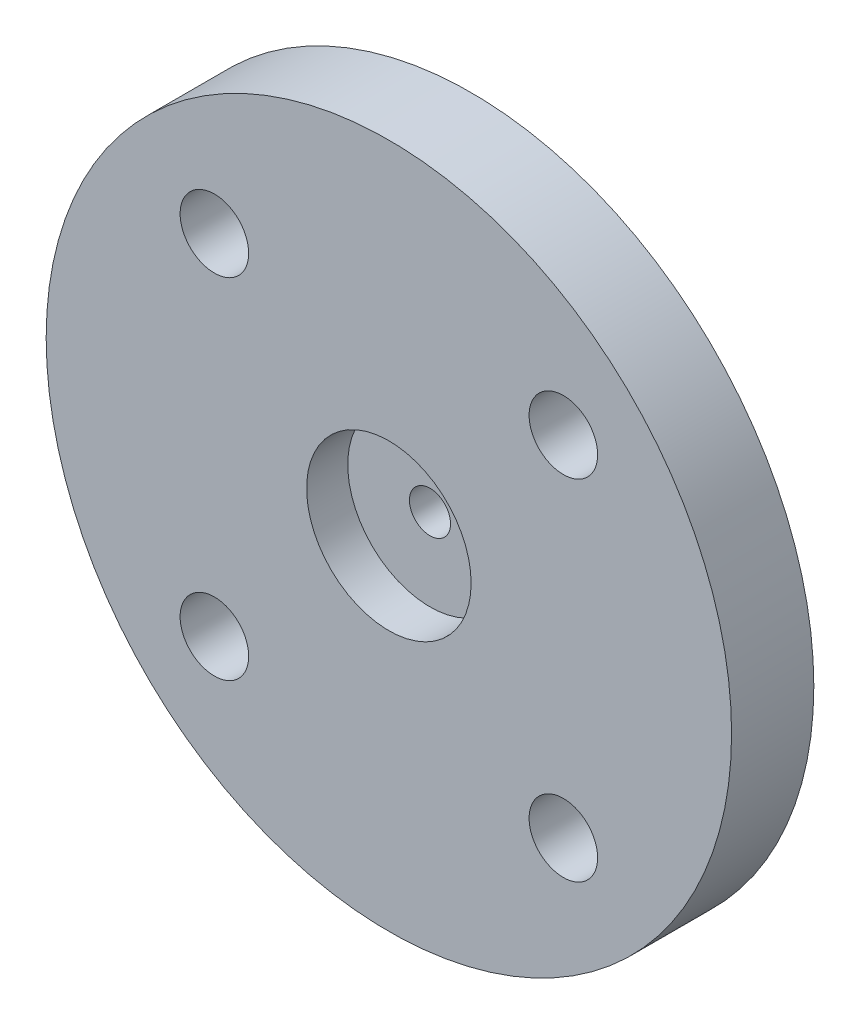
ISO-10303-21;
HEADER;
FILE_DESCRIPTION(('STEP AP214'),'2;1');
FILE_NAME('part.step','',(''),(''),'','','');
FILE_SCHEMA(('AUTOMOTIVE_DESIGN { 1 0 10303 214 1 1 1 1 }'));
ENDSEC;
DATA;
#1=APPLICATION_CONTEXT('core data for automotive mechanical design processes');
#2=APPLICATION_PROTOCOL_DEFINITION('international standard','automotive_design',2000,#1);
#3=PRODUCT_CONTEXT('',#1,'mechanical');
#4=PRODUCT('Part','Part','',(#3));
#5=PRODUCT_RELATED_PRODUCT_CATEGORY('part','',(#4));
#6=PRODUCT_DEFINITION_FORMATION('','',#4);
#7=PRODUCT_DEFINITION_CONTEXT('part definition',#1,'design');
#8=PRODUCT_DEFINITION('design','',#6,#7);
#9=PRODUCT_DEFINITION_SHAPE('','',#8);
#10=(LENGTH_UNIT() NAMED_UNIT(*) SI_UNIT(.MILLI.,.METRE.));
#11=(NAMED_UNIT(*) PLANE_ANGLE_UNIT() SI_UNIT($,.RADIAN.));
#12=(NAMED_UNIT(*) SI_UNIT($,.STERADIAN.) SOLID_ANGLE_UNIT());
#13=UNCERTAINTY_MEASURE_WITH_UNIT(LENGTH_MEASURE(1.E-05),#10,'distance_accuracy_value','');
#14=(GEOMETRIC_REPRESENTATION_CONTEXT(3) GLOBAL_UNCERTAINTY_ASSIGNED_CONTEXT((#13)) GLOBAL_UNIT_ASSIGNED_CONTEXT((#10,
#11,#12)) REPRESENTATION_CONTEXT('',''));
#15=CARTESIAN_POINT('',(0.,0.,0.));
#16=DIRECTION('',(0.,0.,1.));
#17=DIRECTION('',(1.,0.,0.));
#18=AXIS2_PLACEMENT_3D('',#15,#16,#17);
#19=CARTESIAN_POINT('',(0.80744641676439,1.41303122933775,4.5));
#20=DIRECTION('',(0.,0.,-1.));
#21=DIRECTION('',(-1.,0.,0.));
#22=AXIS2_PLACEMENT_3D('',#19,#20,#21);
#23=CYLINDRICAL_SURFACE('',#22,0.75);
#24=CARTESIAN_POINT('',(0.80744641676439,1.41303122933775,1.5));
#25=DIRECTION('',(0.,0.,1.));
#26=DIRECTION('',(1.,0.,0.));
#27=AXIS2_PLACEMENT_3D('',#24,#25,#26);
#28=CIRCLE('',#27,0.75);
#29=CARTESIAN_POINT('',(1.55744641676439,1.41303122933775,1.5));
#30=VERTEX_POINT('',#29);
#31=EDGE_CURVE('E442',#30,#30,#28,.T.);
#32=ORIENTED_EDGE('',*,*,#31,.F.);
#33=EDGE_LOOP('',(#32));
#34=FACE_BOUND('',#33,.T.);
#35=CARTESIAN_POINT('',(0.80744641676439,1.41303122933775,3.));
#36=DIRECTION('',(0.,0.,1.));
#37=DIRECTION('',(1.,0.,0.));
#38=AXIS2_PLACEMENT_3D('',#35,#36,#37);
#39=CIRCLE('',#38,0.75);
#40=CARTESIAN_POINT('',(1.55744641676439,1.41303122933775,3.));
#41=VERTEX_POINT('',#40);
#42=EDGE_CURVE('E42',#41,#41,#39,.T.);
#43=ORIENTED_EDGE('',*,*,#42,.T.);
#44=EDGE_LOOP('',(#43));
#45=FACE_BOUND('',#44,.T.);
#46=ADVANCED_FACE('F38',(#34,#45),#23,.F.);
#47=CARTESIAN_POINT('',(0.80744641676439,1.41303122933775,0.));
#48=DIRECTION('',(0.,0.,1.));
#49=DIRECTION('',(1.,0.,0.));
#50=AXIS2_PLACEMENT_3D('',#47,#48,#49);
#51=PLANE('',#50);
#52=DIRECTION('',(0.,1.,0.));
#53=VECTOR('',#52,1.);
#54=CARTESIAN_POINT('',(2.9074464167644,-5.03696877066226,0.));
#55=LINE('',#54,#53);
#56=CARTESIAN_POINT('',(2.9074464167644,-5.03696877066226,0.));
#57=VERTEX_POINT('',#56);
#58=CARTESIAN_POINT('',(2.9074464167644,-2.06540192798775,0.));
#59=VERTEX_POINT('',#58);
#60=EDGE_CURVE('E63',#57,#59,#55,.T.);
#61=ORIENTED_EDGE('',*,*,#60,.T.);
#62=DIRECTION('',(0.996107574964981,0.0881458966565348,0.));
#63=VECTOR('',#62,1.);
#64=CARTESIAN_POINT('',(2.9074464167644,-2.06540192798775,0.));
#65=LINE('',#64,#63);
#66=CARTESIAN_POINT('',(8.83083638377096,-1.54123914375587,0.));
#67=VERTEX_POINT('',#66);
#68=EDGE_CURVE('E363',#59,#67,#65,.T.);
#69=ORIENTED_EDGE('',*,*,#68,.T.);
#70=CARTESIAN_POINT('',(0.807446416764404,1.41303122933774,0.));
#71=DIRECTION('',(0.,0.,1.));
#72=DIRECTION('',(1.,0.,0.));
#73=AXIS2_PLACEMENT_3D('',#70,#71,#72);
#74=CIRCLE('',#73,8.55000000000001);
#75=CARTESIAN_POINT('',(9.35349161450452,1.15300915684549,0.));
#76=VERTEX_POINT('',#75);
#77=EDGE_CURVE('E359',#67,#76,#74,.T.);
#78=ORIENTED_EDGE('',*,*,#77,.T.);
#79=CARTESIAN_POINT('',(9.65744641676441,1.41303122933774,0.));
#80=DIRECTION('',(0.,0.,-1.));
#81=DIRECTION('',(1.,0.,0.));
#82=AXIS2_PLACEMENT_3D('',#79,#80,#81);
#83=CIRCLE('',#82,0.400000000000015);
#84=CARTESIAN_POINT('',(9.35349161450452,1.67305330182999,0.));
#85=VERTEX_POINT('',#84);
#86=EDGE_CURVE('E355',#76,#85,#83,.T.);
#87=ORIENTED_EDGE('',*,*,#86,.T.);
#88=CARTESIAN_POINT('',(0.807446416764404,1.41303122933775,0.));
#89=DIRECTION('',(0.,0.,1.));
#90=DIRECTION('',(1.,0.,0.));
#91=AXIS2_PLACEMENT_3D('',#88,#89,#90);
#92=CIRCLE('',#91,8.55000000000001);
#93=CARTESIAN_POINT('',(8.83083638377096,4.36730160243135,0.));
#94=VERTEX_POINT('',#93);
#95=EDGE_CURVE('E351',#85,#94,#92,.T.);
#96=ORIENTED_EDGE('',*,*,#95,.T.);
#97=DIRECTION('',(-0.996107574964981,0.088145896656535,0.));
#98=VECTOR('',#97,1.);
#99=CARTESIAN_POINT('',(8.83083638377096,4.36730160243135,0.));
#100=LINE('',#99,#98);
#101=CARTESIAN_POINT('',(2.9074464167644,4.89146438666323,0.));
#102=VERTEX_POINT('',#101);
#103=EDGE_CURVE('E347',#94,#102,#100,.T.);
#104=ORIENTED_EDGE('',*,*,#103,.T.);
#105=DIRECTION('',(0.,1.,0.));
#106=VECTOR('',#105,1.);
#107=CARTESIAN_POINT('',(2.9074464167644,4.89146438666323,0.));
#108=LINE('',#107,#106);
#109=CARTESIAN_POINT('',(2.9074464167644,7.86303122933774,0.));
#110=VERTEX_POINT('',#109);
#111=EDGE_CURVE('E343',#102,#110,#108,.T.);
#112=ORIENTED_EDGE('',*,*,#111,.T.);
#113=CARTESIAN_POINT('',(0.807446416764404,7.86303122933774,0.));
#114=DIRECTION('',(0.,0.,1.));
#115=DIRECTION('',(1.,0.,0.));
#116=AXIS2_PLACEMENT_3D('',#113,#114,#115);
#117=CIRCLE('',#116,2.1);
#118=CARTESIAN_POINT('',(-1.29255358323559,7.86303122933774,0.));
#119=VERTEX_POINT('',#118);
#120=EDGE_CURVE('E339',#110,#119,#117,.T.);
#121=ORIENTED_EDGE('',*,*,#120,.T.);
#122=DIRECTION('',(0.,-1.,0.));
#123=VECTOR('',#122,1.);
#124=CARTESIAN_POINT('',(-1.29255358323559,7.86303122933774,0.));
#125=LINE('',#124,#123);
#126=CARTESIAN_POINT('',(-1.29255358323559,4.39841227704338,0.));
#127=VERTEX_POINT('',#126);
#128=EDGE_CURVE('E335',#119,#127,#125,.T.);
#129=ORIENTED_EDGE('',*,*,#128,.T.);
#130=CARTESIAN_POINT('',(0.80744641676439,1.41303122933773,0.));
#131=DIRECTION('',(0.,0.,1.));
#132=DIRECTION('',(1.,0.,0.));
#133=AXIS2_PLACEMENT_3D('',#130,#131,#132);
#134=CIRCLE('',#133,3.65);
#135=CARTESIAN_POINT('',(-1.47771984528751,4.25917162551985,0.));
#136=VERTEX_POINT('',#135);
#137=EDGE_CURVE('E331',#127,#136,#134,.T.);
#138=ORIENTED_EDGE('',*,*,#137,.T.);
#139=DIRECTION('',(-0.998510440144325,-0.0545609835210728,0.));
#140=VECTOR('',#139,1.);
#141=CARTESIAN_POINT('',(-1.47771984528751,4.25917162551985,0.));
#142=LINE('',#141,#140);
#143=CARTESIAN_POINT('',(-7.36131472499527,3.93767801827224,0.));
#144=VERTEX_POINT('',#143);
#145=EDGE_CURVE('E327',#136,#144,#142,.T.);
#146=ORIENTED_EDGE('',*,*,#145,.T.);
#147=CARTESIAN_POINT('',(0.807446416764404,1.41303122933775,0.));
#148=DIRECTION('',(0.,0.,1.));
#149=DIRECTION('',(1.,0.,0.));
#150=AXIS2_PLACEMENT_3D('',#147,#148,#149);
#151=CIRCLE('',#150,8.55000000000001);
#152=CARTESIAN_POINT('',(-7.73367784359063,1.80251341015576,0.));
#153=VERTEX_POINT('',#152);
#154=EDGE_CURVE('E323',#144,#153,#151,.T.);
#155=ORIENTED_EDGE('',*,*,#154,.T.);
#156=CARTESIAN_POINT('',(-7.6425535832356,1.41303122933774,0.));
#157=DIRECTION('',(0.,0.,-1.));
#158=DIRECTION('',(1.,0.,0.));
#159=AXIS2_PLACEMENT_3D('',#156,#157,#158);
#160=CIRCLE('',#159,0.400000000000013);
#161=CARTESIAN_POINT('',(-7.73367784359063,1.02354904851972,0.));
#162=VERTEX_POINT('',#161);
#163=EDGE_CURVE('E319',#153,#162,#160,.T.);
#164=ORIENTED_EDGE('',*,*,#163,.T.);
#165=CARTESIAN_POINT('',(0.807446416764404,1.41303122933773,0.));
#166=DIRECTION('',(0.,0.,1.));
#167=DIRECTION('',(1.,0.,0.));
#168=AXIS2_PLACEMENT_3D('',#165,#166,#167);
#169=CIRCLE('',#168,8.55);
#170=CARTESIAN_POINT('',(-7.36131472499527,-1.11161555959676,0.));
#171=VERTEX_POINT('',#170);
#172=EDGE_CURVE('E315',#162,#171,#169,.T.);
#173=ORIENTED_EDGE('',*,*,#172,.T.);
#174=DIRECTION('',(0.998510440144325,-0.0545609835210726,0.));
#175=VECTOR('',#174,1.);
#176=CARTESIAN_POINT('',(-7.36131472499527,-1.11161555959676,0.));
#177=LINE('',#176,#175);
#178=CARTESIAN_POINT('',(-1.47771984528751,-1.43310916684437,0.));
#179=VERTEX_POINT('',#178);
#180=EDGE_CURVE('E311',#171,#179,#177,.T.);
#181=ORIENTED_EDGE('',*,*,#180,.T.);
#182=CARTESIAN_POINT('',(0.80744641676439,1.41303122933775,0.));
#183=DIRECTION('',(0.,0.,1.));
#184=DIRECTION('',(1.,0.,0.));
#185=AXIS2_PLACEMENT_3D('',#182,#183,#184);
#186=CIRCLE('',#185,3.65);
#187=CARTESIAN_POINT('',(-1.2925535832356,-1.5723498183679,0.));
#188=VERTEX_POINT('',#187);
#189=EDGE_CURVE('E307',#179,#188,#186,.T.);
#190=ORIENTED_EDGE('',*,*,#189,.T.);
#191=DIRECTION('',(0.,-1.,0.));
#192=VECTOR('',#191,1.);
#193=CARTESIAN_POINT('',(-1.29255358323559,-1.5723498183679,0.));
#194=LINE('',#193,#192);
#195=CARTESIAN_POINT('',(-1.29255358323559,-5.03696877066226,0.));
#196=VERTEX_POINT('',#195);
#197=EDGE_CURVE('E303',#188,#196,#194,.T.);
#198=ORIENTED_EDGE('',*,*,#197,.T.);
#199=CARTESIAN_POINT('',(0.807446416764404,-5.03696877066226,0.));
#200=DIRECTION('',(0.,0.,1.));
#201=DIRECTION('',(1.,0.,0.));
#202=AXIS2_PLACEMENT_3D('',#199,#200,#201);
#203=CIRCLE('',#202,2.1);
#204=EDGE_CURVE('E298',#196,#57,#203,.T.);
#205=ORIENTED_EDGE('',*,*,#204,.T.);
#206=EDGE_LOOP('',(#61,#69,#78,#87,#96,#104,#112,#121,#129,#138,#146,#155,#164,#173,#181,#190,
#198,#205));
#207=FACE_BOUND('',#206,.T.);
#208=CARTESIAN_POINT('',(0.80744641676439,1.41303122933775,0.));
#209=DIRECTION('',(0.,0.,-1.));
#210=DIRECTION('',(-1.,0.,0.));
#211=AXIS2_PLACEMENT_3D('',#208,#209,#210);
#212=CIRCLE('',#211,9.5);
#213=CARTESIAN_POINT('',(-5.02781570508525,8.90967821110945,0.));
#214=VERTEX_POINT('',#213);
#215=CARTESIAN_POINT('',(6.64270853861411,8.90967821110939,0.));
#216=VERTEX_POINT('',#215);
#217=EDGE_CURVE('E219',#214,#216,#212,.T.);
#218=ORIENTED_EDGE('',*,*,#217,.T.);
#219=CARTESIAN_POINT('',(7.17140744744332,7.77699226001668,0.));
#220=DIRECTION('',(0.,0.,1.));
#221=DIRECTION('',(1.,0.,0.));
#222=AXIS2_PLACEMENT_3D('',#219,#220,#221);
#223=CIRCLE('',#222,1.25);
#224=CARTESIAN_POINT('',(8.30409339853603,7.24829335118747,0.));
#225=VERTEX_POINT('',#224);
#226=EDGE_CURVE('E446',#216,#225,#223,.T.);
#227=ORIENTED_EDGE('',*,*,#226,.T.);
#228=CARTESIAN_POINT('',(8.30409339853601,-4.422230892512,0.));
#229=VERTEX_POINT('',#228);
#230=EDGE_CURVE('E670',#225,#229,#212,.T.);
#231=ORIENTED_EDGE('',*,*,#230,.T.);
#232=CARTESIAN_POINT('',(7.1714074474433,-4.9509298013412,0.));
#233=DIRECTION('',(0.,0.,1.));
#234=DIRECTION('',(1.,0.,0.));
#235=AXIS2_PLACEMENT_3D('',#232,#233,#234);
#236=CIRCLE('',#235,1.25);
#237=CARTESIAN_POINT('',(6.64270853861409,-6.08361575243391,0.));
#238=VERTEX_POINT('',#237);
#239=EDGE_CURVE('E450',#229,#238,#236,.T.);
#240=ORIENTED_EDGE('',*,*,#239,.T.);
#241=CARTESIAN_POINT('',(-5.02781570508539,-6.08361575243385,0.));
#242=VERTEX_POINT('',#241);
#243=EDGE_CURVE('E508',#238,#242,#212,.T.);
#244=ORIENTED_EDGE('',*,*,#243,.T.);
#245=CARTESIAN_POINT('',(-5.55651461391458,-4.95092980134113,0.));
#246=DIRECTION('',(0.,0.,1.));
#247=DIRECTION('',(1.,0.,0.));
#248=AXIS2_PLACEMENT_3D('',#245,#246,#247);
#249=CIRCLE('',#248,1.25);
#250=CARTESIAN_POINT('',(-6.68920056500729,-4.42223089251192,0.));
#251=VERTEX_POINT('',#250);
#252=EDGE_CURVE('E465',#242,#251,#249,.T.);
#253=ORIENTED_EDGE('',*,*,#252,.T.);
#254=CARTESIAN_POINT('',(-6.68920056500719,7.24829335118755,0.));
#255=VERTEX_POINT('',#254);
#256=EDGE_CURVE('E505',#251,#255,#212,.T.);
#257=ORIENTED_EDGE('',*,*,#256,.T.);
#258=CARTESIAN_POINT('',(-5.55651461391447,7.77699226001675,0.));
#259=DIRECTION('',(0.,0.,1.));
#260=DIRECTION('',(1.,0.,0.));
#261=AXIS2_PLACEMENT_3D('',#258,#259,#260);
#262=CIRCLE('',#261,1.25);
#263=EDGE_CURVE('E458',#255,#214,#262,.T.);
#264=ORIENTED_EDGE('',*,*,#263,.T.);
#265=EDGE_LOOP('',(#218,#227,#231,#240,#244,#253,#257,#264));
#266=FACE_BOUND('',#265,.T.);
#267=ADVANCED_FACE('F537',(#207,#266),#51,.F.);
#268=CARTESIAN_POINT('',(0.80744641676439,1.41303122933775,1.5));
#269=DIRECTION('',(0.,0.,-1.));
#270=DIRECTION('',(-1.,0.,0.));
#271=AXIS2_PLACEMENT_3D('',#268,#269,#270);
#272=CYLINDRICAL_SURFACE('',#271,12.5);
#273=CARTESIAN_POINT('',(0.80744641676439,1.41303122933775,4.5));
#274=DIRECTION('',(0.,0.,1.));
#275=DIRECTION('',(1.,0.,0.));
#276=AXIS2_PLACEMENT_3D('',#273,#274,#275);
#277=CIRCLE('',#276,12.5);
#278=CARTESIAN_POINT('',(13.3074464167644,1.41303122933775,4.5));
#279=VERTEX_POINT('',#278);
#280=EDGE_CURVE('E369',#279,#279,#277,.T.);
#281=ORIENTED_EDGE('',*,*,#280,.F.);
#282=EDGE_LOOP('',(#281));
#283=FACE_BOUND('',#282,.T.);
#284=CARTESIAN_POINT('',(0.80744641676439,1.41303122933775,1.5));
#285=DIRECTION('',(0.,0.,-1.));
#286=DIRECTION('',(-1.,0.,0.));
#287=AXIS2_PLACEMENT_3D('',#284,#285,#286);
#288=CIRCLE('',#287,12.5);
#289=CARTESIAN_POINT('',(-11.6925535832356,1.41303122933775,1.5));
#290=VERTEX_POINT('',#289);
#291=EDGE_CURVE('E231',#290,#290,#288,.T.);
#292=ORIENTED_EDGE('',*,*,#291,.F.);
#293=EDGE_LOOP('',(#292));
#294=FACE_BOUND('',#293,.T.);
#295=ADVANCED_FACE('F40',(#283,#294),#272,.T.);
#296=CARTESIAN_POINT('',(7.17140744744332,7.77699226001668,0.));
#297=DIRECTION('',(0.,0.,1.));
#298=DIRECTION('',(1.,0.,0.));
#299=AXIS2_PLACEMENT_3D('',#296,#297,#298);
#300=CYLINDRICAL_SURFACE('',#299,1.25);
#301=CARTESIAN_POINT('',(7.17140744744332,7.77699226001668,4.5));
#302=DIRECTION('',(0.,0.,1.));
#303=DIRECTION('',(1.,0.,0.));
#304=AXIS2_PLACEMENT_3D('',#301,#302,#303);
#305=CIRCLE('',#304,1.25);
#306=CARTESIAN_POINT('',(8.42140744744332,7.77699226001668,4.5));
#307=VERTEX_POINT('',#306);
#308=EDGE_CURVE('E447',#307,#307,#305,.T.);
#309=ORIENTED_EDGE('',*,*,#308,.T.);
#310=EDGE_LOOP('',(#309));
#311=FACE_BOUND('',#310,.T.);
#312=DIRECTION('',(0.,0.,-1.));
#313=VECTOR('',#312,1.);
#314=CARTESIAN_POINT('',(8.30409339853603,7.24829335118747,0.75));
#315=LINE('',#314,#313);
#316=CARTESIAN_POINT('',(8.30409339853603,7.24829335118747,1.5));
#317=VERTEX_POINT('',#316);
#318=EDGE_CURVE('E484',#225,#317,#315,.F.);
#319=ORIENTED_EDGE('',*,*,#318,.F.);
#320=ORIENTED_EDGE('',*,*,#226,.F.);
#321=DIRECTION('',(0.,0.,-1.));
#322=VECTOR('',#321,1.);
#323=CARTESIAN_POINT('',(6.64270853861411,8.90967821110939,0.75));
#324=LINE('',#323,#322);
#325=CARTESIAN_POINT('',(6.64270853861411,8.90967821110939,1.5));
#326=VERTEX_POINT('',#325);
#327=EDGE_CURVE('E487',#326,#216,#324,.T.);
#328=ORIENTED_EDGE('',*,*,#327,.F.);
#329=CARTESIAN_POINT('',(7.17140744744332,7.77699226001668,1.5));
#330=DIRECTION('',(0.,0.,-1.));
#331=DIRECTION('',(-1.,0.,0.));
#332=AXIS2_PLACEMENT_3D('',#329,#330,#331);
#333=CIRCLE('',#332,1.25);
#334=EDGE_CURVE('E229',#317,#326,#333,.F.);
#335=ORIENTED_EDGE('',*,*,#334,.F.);
#336=EDGE_LOOP('',(#319,#320,#328,#335));
#337=FACE_BOUND('',#336,.T.);
#338=ADVANCED_FACE('F547',(#311,#337),#300,.F.);
#339=CARTESIAN_POINT('',(7.1714074474433,-4.9509298013412,0.));
#340=DIRECTION('',(0.,0.,1.));
#341=DIRECTION('',(1.,0.,0.));
#342=AXIS2_PLACEMENT_3D('',#339,#340,#341);
#343=CYLINDRICAL_SURFACE('',#342,1.25);
#344=CARTESIAN_POINT('',(7.1714074474433,-4.9509298013412,4.5));
#345=DIRECTION('',(0.,0.,1.));
#346=DIRECTION('',(1.,0.,0.));
#347=AXIS2_PLACEMENT_3D('',#344,#345,#346);
#348=CIRCLE('',#347,1.25);
#349=CARTESIAN_POINT('',(8.4214074474433,-4.9509298013412,4.5));
#350=VERTEX_POINT('',#349);
#351=EDGE_CURVE('E469',#350,#350,#348,.T.);
#352=ORIENTED_EDGE('',*,*,#351,.T.);
#353=EDGE_LOOP('',(#352));
#354=FACE_BOUND('',#353,.T.);
#355=DIRECTION('',(0.,0.,-1.));
#356=VECTOR('',#355,1.);
#357=CARTESIAN_POINT('',(6.64270853861409,-6.08361575243391,0.75));
#358=LINE('',#357,#356);
#359=CARTESIAN_POINT('',(6.64270853861409,-6.08361575243391,1.5));
#360=VERTEX_POINT('',#359);
#361=EDGE_CURVE('E490',#238,#360,#358,.F.);
#362=ORIENTED_EDGE('',*,*,#361,.F.);
#363=ORIENTED_EDGE('',*,*,#239,.F.);
#364=DIRECTION('',(0.,0.,-1.));
#365=VECTOR('',#364,1.);
#366=CARTESIAN_POINT('',(8.30409339853601,-4.422230892512,0.75));
#367=LINE('',#366,#365);
#368=CARTESIAN_POINT('',(8.30409339853601,-4.422230892512,1.5));
#369=VERTEX_POINT('',#368);
#370=EDGE_CURVE('E493',#369,#229,#367,.T.);
#371=ORIENTED_EDGE('',*,*,#370,.F.);
#372=CARTESIAN_POINT('',(7.1714074474433,-4.9509298013412,1.5));
#373=DIRECTION('',(0.,0.,-1.));
#374=DIRECTION('',(-1.,0.,0.));
#375=AXIS2_PLACEMENT_3D('',#372,#373,#374);
#376=CIRCLE('',#375,1.25);
#377=EDGE_CURVE('E478',#360,#369,#376,.F.);
#378=ORIENTED_EDGE('',*,*,#377,.F.);
#379=EDGE_LOOP('',(#362,#363,#371,#378));
#380=FACE_BOUND('',#379,.T.);
#381=ADVANCED_FACE('F635',(#354,#380),#343,.F.);
#382=CARTESIAN_POINT('',(-5.55651461391458,-4.95092980134113,0.));
#383=DIRECTION('',(0.,0.,1.));
#384=DIRECTION('',(1.,0.,0.));
#385=AXIS2_PLACEMENT_3D('',#382,#383,#384);
#386=CYLINDRICAL_SURFACE('',#385,1.25);
#387=CARTESIAN_POINT('',(-5.55651461391458,-4.95092980134113,4.5));
#388=DIRECTION('',(0.,0.,1.));
#389=DIRECTION('',(1.,0.,0.));
#390=AXIS2_PLACEMENT_3D('',#387,#388,#389);
#391=CIRCLE('',#390,1.25);
#392=CARTESIAN_POINT('',(-4.30651461391458,-4.95092980134113,4.5));
#393=VERTEX_POINT('',#392);
#394=EDGE_CURVE('E461',#393,#393,#391,.T.);
#395=ORIENTED_EDGE('',*,*,#394,.T.);
#396=EDGE_LOOP('',(#395));
#397=FACE_BOUND('',#396,.T.);
#398=DIRECTION('',(0.,0.,-1.));
#399=VECTOR('',#398,1.);
#400=CARTESIAN_POINT('',(-6.68920056500729,-4.42223089251192,0.75));
#401=LINE('',#400,#399);
#402=CARTESIAN_POINT('',(-6.68920056500729,-4.42223089251192,1.5));
#403=VERTEX_POINT('',#402);
#404=EDGE_CURVE('E496',#251,#403,#401,.F.);
#405=ORIENTED_EDGE('',*,*,#404,.F.);
#406=ORIENTED_EDGE('',*,*,#252,.F.);
#407=DIRECTION('',(0.,0.,-1.));
#408=VECTOR('',#407,1.);
#409=CARTESIAN_POINT('',(-5.02781570508539,-6.08361575243385,0.75));
#410=LINE('',#409,#408);
#411=CARTESIAN_POINT('',(-5.02781570508539,-6.08361575243385,1.5));
#412=VERTEX_POINT('',#411);
#413=EDGE_CURVE('E499',#412,#242,#410,.T.);
#414=ORIENTED_EDGE('',*,*,#413,.F.);
#415=CARTESIAN_POINT('',(-5.55651461391458,-4.95092980134113,1.5));
#416=DIRECTION('',(0.,0.,-1.));
#417=DIRECTION('',(-1.,0.,0.));
#418=AXIS2_PLACEMENT_3D('',#415,#416,#417);
#419=CIRCLE('',#418,1.25);
#420=EDGE_CURVE('E481',#403,#412,#419,.F.);
#421=ORIENTED_EDGE('',*,*,#420,.F.);
#422=EDGE_LOOP('',(#405,#406,#414,#421));
#423=FACE_BOUND('',#422,.T.);
#424=ADVANCED_FACE('F630',(#397,#423),#386,.F.);
#425=CARTESIAN_POINT('',(-5.55651461391447,7.77699226001675,0.));
#426=DIRECTION('',(0.,0.,1.));
#427=DIRECTION('',(1.,0.,0.));
#428=AXIS2_PLACEMENT_3D('',#425,#426,#427);
#429=CYLINDRICAL_SURFACE('',#428,1.25);
#430=CARTESIAN_POINT('',(-5.55651461391447,7.77699226001675,4.5));
#431=DIRECTION('',(0.,0.,1.));
#432=DIRECTION('',(1.,0.,0.));
#433=AXIS2_PLACEMENT_3D('',#430,#431,#432);
#434=CIRCLE('',#433,1.25);
#435=CARTESIAN_POINT('',(-4.30651461391447,7.77699226001675,4.5));
#436=VERTEX_POINT('',#435);
#437=EDGE_CURVE('E454',#436,#436,#434,.T.);
#438=ORIENTED_EDGE('',*,*,#437,.T.);
#439=EDGE_LOOP('',(#438));
#440=FACE_BOUND('',#439,.T.);
#441=DIRECTION('',(0.,0.,-1.));
#442=VECTOR('',#441,1.);
#443=CARTESIAN_POINT('',(-5.02781570508525,8.90967821110945,0.75));
#444=LINE('',#443,#442);
#445=CARTESIAN_POINT('',(-5.02781570508525,8.90967821110945,1.5));
#446=VERTEX_POINT('',#445);
#447=EDGE_CURVE('E11',#214,#446,#444,.F.);
#448=ORIENTED_EDGE('',*,*,#447,.F.);
#449=ORIENTED_EDGE('',*,*,#263,.F.);
#450=DIRECTION('',(0.,0.,-1.));
#451=VECTOR('',#450,1.);
#452=CARTESIAN_POINT('',(-6.68920056500719,7.24829335118755,0.75));
#453=LINE('',#452,#451);
#454=CARTESIAN_POINT('',(-6.68920056500719,7.24829335118755,1.5));
#455=VERTEX_POINT('',#454);
#456=EDGE_CURVE('E235',#455,#255,#453,.T.);
#457=ORIENTED_EDGE('',*,*,#456,.F.);
#458=CARTESIAN_POINT('',(-5.55651461391447,7.77699226001675,1.5));
#459=DIRECTION('',(0.,0.,-1.));
#460=DIRECTION('',(-1.,0.,0.));
#461=AXIS2_PLACEMENT_3D('',#458,#459,#460);
#462=CIRCLE('',#461,1.25);
#463=EDGE_CURVE('E48',#446,#455,#462,.F.);
#464=ORIENTED_EDGE('',*,*,#463,.F.);
#465=EDGE_LOOP('',(#448,#449,#457,#464));
#466=FACE_BOUND('',#465,.T.);
#467=ADVANCED_FACE('F234',(#440,#466),#429,.F.);
#468=CARTESIAN_POINT('',(2.9074464167644,-5.03696877066226,1.5));
#469=DIRECTION('',(-1.,0.,0.));
#470=DIRECTION('',(0.,0.,1.));
#471=AXIS2_PLACEMENT_3D('',#468,#469,#470);
#472=PLANE('',#471);
#473=ORIENTED_EDGE('',*,*,#60,.F.);
#474=DIRECTION('',(0.,0.,-1.));
#475=VECTOR('',#474,1.);
#476=CARTESIAN_POINT('',(2.9074464167644,-5.03696877066226,1.5));
#477=LINE('',#476,#475);
#478=CARTESIAN_POINT('',(2.9074464167644,-5.03696877066226,1.5));
#479=VERTEX_POINT('',#478);
#480=EDGE_CURVE('E294',#479,#57,#477,.T.);
#481=ORIENTED_EDGE('',*,*,#480,.F.);
#482=DIRECTION('',(0.,1.,0.));
#483=VECTOR('',#482,1.);
#484=CARTESIAN_POINT('',(2.9074464167644,-5.03696877066226,1.5));
#485=LINE('',#484,#483);
#486=CARTESIAN_POINT('',(2.9074464167644,-2.06540192798775,1.5));
#487=VERTEX_POINT('',#486);
#488=EDGE_CURVE('E302',#479,#487,#485,.T.);
#489=ORIENTED_EDGE('',*,*,#488,.T.);
#490=DIRECTION('',(0.,0.,-1.));
#491=VECTOR('',#490,1.);
#492=CARTESIAN_POINT('',(2.9074464167644,-2.06540192798775,1.5));
#493=LINE('',#492,#491);
#494=EDGE_CURVE('E241',#487,#59,#493,.T.);
#495=ORIENTED_EDGE('',*,*,#494,.T.);
#496=EDGE_LOOP('',(#473,#481,#489,#495));
#497=FACE_BOUND('',#496,.T.);
#498=ADVANCED_FACE('F624',(#497),#472,.T.);
#499=CARTESIAN_POINT('',(2.9074464167644,-2.06540192798775,1.5));
#500=DIRECTION('',(-0.0881458966565348,0.996107574964981,0.));
#501=DIRECTION('',(-0.996107574964981,-0.0881458966565348,0.));
#502=AXIS2_PLACEMENT_3D('',#499,#500,#501);
#503=PLANE('',#502);
#504=ORIENTED_EDGE('',*,*,#68,.F.);
#505=ORIENTED_EDGE('',*,*,#494,.F.);
#506=DIRECTION('',(0.996107574964981,0.0881458966565348,0.));
#507=VECTOR('',#506,1.);
#508=CARTESIAN_POINT('',(2.9074464167644,-2.06540192798775,1.5));
#509=LINE('',#508,#507);
#510=CARTESIAN_POINT('',(8.83083638377096,-1.54123914375587,1.5));
#511=VERTEX_POINT('',#510);
#512=EDGE_CURVE('E432',#487,#511,#509,.T.);
#513=ORIENTED_EDGE('',*,*,#512,.T.);
#514=DIRECTION('',(0.,0.,-1.));
#515=VECTOR('',#514,1.);
#516=CARTESIAN_POINT('',(8.83083638377096,-1.54123914375587,1.5));
#517=LINE('',#516,#515);
#518=EDGE_CURVE('E246',#511,#67,#517,.T.);
#519=ORIENTED_EDGE('',*,*,#518,.T.);
#520=EDGE_LOOP('',(#504,#505,#513,#519));
#521=FACE_BOUND('',#520,.T.);
#522=ADVANCED_FACE('F620',(#521),#503,.T.);
#523=CARTESIAN_POINT('',(0.807446416764404,1.41303122933774,1.5));
#524=DIRECTION('',(0.,0.,-1.));
#525=DIRECTION('',(-1.,0.,0.));
#526=AXIS2_PLACEMENT_3D('',#523,#524,#525);
#527=CYLINDRICAL_SURFACE('',#526,8.55000000000001);
#528=ORIENTED_EDGE('',*,*,#77,.F.);
#529=ORIENTED_EDGE('',*,*,#518,.F.);
#530=CARTESIAN_POINT('',(0.807446416764404,1.41303122933774,1.5));
#531=DIRECTION('',(0.,0.,1.));
#532=DIRECTION('',(1.,0.,0.));
#533=AXIS2_PLACEMENT_3D('',#530,#531,#532);
#534=CIRCLE('',#533,8.55000000000001);
#535=CARTESIAN_POINT('',(9.35349161450452,1.15300915684549,1.5));
#536=VERTEX_POINT('',#535);
#537=EDGE_CURVE('E428',#511,#536,#534,.T.);
#538=ORIENTED_EDGE('',*,*,#537,.T.);
#539=DIRECTION('',(0.,0.,-1.));
#540=VECTOR('',#539,1.);
#541=CARTESIAN_POINT('',(9.35349161450452,1.15300915684549,1.5));
#542=LINE('',#541,#540);
#543=EDGE_CURVE('E249',#536,#76,#542,.T.);
#544=ORIENTED_EDGE('',*,*,#543,.T.);
#545=EDGE_LOOP('',(#528,#529,#538,#544));
#546=FACE_BOUND('',#545,.T.);
#547=ADVANCED_FACE('F616',(#546),#527,.F.);
#548=CARTESIAN_POINT('',(9.65744641676441,1.41303122933774,1.5));
#549=DIRECTION('',(0.,0.,-1.));
#550=DIRECTION('',(-1.,0.,0.));
#551=AXIS2_PLACEMENT_3D('',#548,#549,#550);
#552=CYLINDRICAL_SURFACE('',#551,0.400000000000015);
#553=ORIENTED_EDGE('',*,*,#86,.F.);
#554=ORIENTED_EDGE('',*,*,#543,.F.);
#555=CARTESIAN_POINT('',(9.65744641676441,1.41303122933774,1.5));
#556=DIRECTION('',(0.,0.,-1.));
#557=DIRECTION('',(1.,0.,0.));
#558=AXIS2_PLACEMENT_3D('',#555,#556,#557);
#559=CIRCLE('',#558,0.400000000000015);
#560=CARTESIAN_POINT('',(9.35349161450452,1.67305330182999,1.5));
#561=VERTEX_POINT('',#560);
#562=EDGE_CURVE('E424',#536,#561,#559,.T.);
#563=ORIENTED_EDGE('',*,*,#562,.T.);
#564=DIRECTION('',(0.,0.,-1.));
#565=VECTOR('',#564,1.);
#566=CARTESIAN_POINT('',(9.35349161450452,1.67305330182999,1.5));
#567=LINE('',#566,#565);
#568=EDGE_CURVE('E252',#561,#85,#567,.T.);
#569=ORIENTED_EDGE('',*,*,#568,.T.);
#570=EDGE_LOOP('',(#553,#554,#563,#569));
#571=FACE_BOUND('',#570,.T.);
#572=ADVANCED_FACE('F612',(#571),#552,.T.);
#573=CARTESIAN_POINT('',(0.807446416764404,1.41303122933775,1.5));
#574=DIRECTION('',(0.,0.,-1.));
#575=DIRECTION('',(-1.,0.,0.));
#576=AXIS2_PLACEMENT_3D('',#573,#574,#575);
#577=CYLINDRICAL_SURFACE('',#576,8.55000000000001);
#578=ORIENTED_EDGE('',*,*,#95,.F.);
#579=ORIENTED_EDGE('',*,*,#568,.F.);
#580=CARTESIAN_POINT('',(0.807446416764404,1.41303122933775,1.5));
#581=DIRECTION('',(0.,0.,1.));
#582=DIRECTION('',(1.,0.,0.));
#583=AXIS2_PLACEMENT_3D('',#580,#581,#582);
#584=CIRCLE('',#583,8.55000000000001);
#585=CARTESIAN_POINT('',(8.83083638377096,4.36730160243135,1.5));
#586=VERTEX_POINT('',#585);
#587=EDGE_CURVE('E420',#561,#586,#584,.T.);
#588=ORIENTED_EDGE('',*,*,#587,.T.);
#589=DIRECTION('',(0.,0.,-1.));
#590=VECTOR('',#589,1.);
#591=CARTESIAN_POINT('',(8.83083638377096,4.36730160243135,1.5));
#592=LINE('',#591,#590);
#593=EDGE_CURVE('E255',#586,#94,#592,.T.);
#594=ORIENTED_EDGE('',*,*,#593,.T.);
#595=EDGE_LOOP('',(#578,#579,#588,#594));
#596=FACE_BOUND('',#595,.T.);
#597=ADVANCED_FACE('F608',(#596),#577,.F.);
#598=CARTESIAN_POINT('',(8.83083638377096,4.36730160243135,1.5));
#599=DIRECTION('',(-0.088145896656535,-0.996107574964981,0.));
#600=DIRECTION('',(0.996107574964981,-0.088145896656535,0.));
#601=AXIS2_PLACEMENT_3D('',#598,#599,#600);
#602=PLANE('',#601);
#603=ORIENTED_EDGE('',*,*,#103,.F.);
#604=ORIENTED_EDGE('',*,*,#593,.F.);
#605=DIRECTION('',(-0.996107574964981,0.088145896656535,0.));
#606=VECTOR('',#605,1.);
#607=CARTESIAN_POINT('',(8.83083638377096,4.36730160243135,1.5));
#608=LINE('',#607,#606);
#609=CARTESIAN_POINT('',(2.9074464167644,4.89146438666323,1.5));
#610=VERTEX_POINT('',#609);
#611=EDGE_CURVE('E417',#586,#610,#608,.T.);
#612=ORIENTED_EDGE('',*,*,#611,.T.);
#613=DIRECTION('',(0.,0.,-1.));
#614=VECTOR('',#613,1.);
#615=CARTESIAN_POINT('',(2.9074464167644,4.89146438666323,1.5));
#616=LINE('',#615,#614);
#617=EDGE_CURVE('E258',#610,#102,#616,.T.);
#618=ORIENTED_EDGE('',*,*,#617,.T.);
#619=EDGE_LOOP('',(#603,#604,#612,#618));
#620=FACE_BOUND('',#619,.T.);
#621=ADVANCED_FACE('F604',(#620),#602,.T.);
#622=CARTESIAN_POINT('',(2.9074464167644,4.89146438666323,1.5));
#623=DIRECTION('',(-1.,0.,0.));
#624=DIRECTION('',(0.,0.,1.));
#625=AXIS2_PLACEMENT_3D('',#622,#623,#624);
#626=PLANE('',#625);
#627=ORIENTED_EDGE('',*,*,#111,.F.);
#628=ORIENTED_EDGE('',*,*,#617,.F.);
#629=DIRECTION('',(0.,1.,0.));
#630=VECTOR('',#629,1.);
#631=CARTESIAN_POINT('',(2.9074464167644,4.89146438666323,1.5));
#632=LINE('',#631,#630);
#633=CARTESIAN_POINT('',(2.9074464167644,7.86303122933774,1.5));
#634=VERTEX_POINT('',#633);
#635=EDGE_CURVE('E413',#610,#634,#632,.T.);
#636=ORIENTED_EDGE('',*,*,#635,.T.);
#637=DIRECTION('',(0.,0.,-1.));
#638=VECTOR('',#637,1.);
#639=CARTESIAN_POINT('',(2.9074464167644,7.86303122933774,1.5));
#640=LINE('',#639,#638);
#641=EDGE_CURVE('E261',#634,#110,#640,.T.);
#642=ORIENTED_EDGE('',*,*,#641,.T.);
#643=EDGE_LOOP('',(#627,#628,#636,#642));
#644=FACE_BOUND('',#643,.T.);
#645=ADVANCED_FACE('F600',(#644),#626,.T.);
#646=CARTESIAN_POINT('',(0.807446416764404,7.86303122933774,1.5));
#647=DIRECTION('',(0.,0.,-1.));
#648=DIRECTION('',(-1.,0.,0.));
#649=AXIS2_PLACEMENT_3D('',#646,#647,#648);
#650=CYLINDRICAL_SURFACE('',#649,2.1);
#651=ORIENTED_EDGE('',*,*,#120,.F.);
#652=ORIENTED_EDGE('',*,*,#641,.F.);
#653=CARTESIAN_POINT('',(0.807446416764404,7.86303122933774,1.5));
#654=DIRECTION('',(0.,0.,1.));
#655=DIRECTION('',(1.,0.,0.));
#656=AXIS2_PLACEMENT_3D('',#653,#654,#655);
#657=CIRCLE('',#656,2.1);
#658=CARTESIAN_POINT('',(-1.29255358323559,7.86303122933774,1.5));
#659=VERTEX_POINT('',#658);
#660=EDGE_CURVE('E409',#634,#659,#657,.T.);
#661=ORIENTED_EDGE('',*,*,#660,.T.);
#662=DIRECTION('',(0.,0.,-1.));
#663=VECTOR('',#662,1.);
#664=CARTESIAN_POINT('',(-1.29255358323559,7.86303122933774,1.5));
#665=LINE('',#664,#663);
#666=EDGE_CURVE('E264',#659,#119,#665,.T.);
#667=ORIENTED_EDGE('',*,*,#666,.T.);
#668=EDGE_LOOP('',(#651,#652,#661,#667));
#669=FACE_BOUND('',#668,.T.);
#670=ADVANCED_FACE('F596',(#669),#650,.F.);
#671=CARTESIAN_POINT('',(-1.29255358323559,7.86303122933774,1.5));
#672=DIRECTION('',(1.,0.,0.));
#673=DIRECTION('',(0.,0.,-1.));
#674=AXIS2_PLACEMENT_3D('',#671,#672,#673);
#675=PLANE('',#674);
#676=ORIENTED_EDGE('',*,*,#128,.F.);
#677=ORIENTED_EDGE('',*,*,#666,.F.);
#678=DIRECTION('',(0.,-1.,0.));
#679=VECTOR('',#678,1.);
#680=CARTESIAN_POINT('',(-1.29255358323559,7.86303122933774,1.5));
#681=LINE('',#680,#679);
#682=CARTESIAN_POINT('',(-1.29255358323559,4.39841227704338,1.5));
#683=VERTEX_POINT('',#682);
#684=EDGE_CURVE('E405',#659,#683,#681,.T.);
#685=ORIENTED_EDGE('',*,*,#684,.T.);
#686=DIRECTION('',(0.,0.,-1.));
#687=VECTOR('',#686,1.);
#688=CARTESIAN_POINT('',(-1.29255358323559,4.39841227704338,1.5));
#689=LINE('',#688,#687);
#690=EDGE_CURVE('E267',#683,#127,#689,.T.);
#691=ORIENTED_EDGE('',*,*,#690,.T.);
#692=EDGE_LOOP('',(#676,#677,#685,#691));
#693=FACE_BOUND('',#692,.T.);
#694=ADVANCED_FACE('F592',(#693),#675,.T.);
#695=CARTESIAN_POINT('',(0.80744641676439,1.41303122933773,1.5));
#696=DIRECTION('',(0.,0.,-1.));
#697=DIRECTION('',(-1.,0.,0.));
#698=AXIS2_PLACEMENT_3D('',#695,#696,#697);
#699=CYLINDRICAL_SURFACE('',#698,3.65);
#700=ORIENTED_EDGE('',*,*,#137,.F.);
#701=ORIENTED_EDGE('',*,*,#690,.F.);
#702=CARTESIAN_POINT('',(0.80744641676439,1.41303122933773,1.5));
#703=DIRECTION('',(0.,0.,1.));
#704=DIRECTION('',(1.,0.,0.));
#705=AXIS2_PLACEMENT_3D('',#702,#703,#704);
#706=CIRCLE('',#705,3.65);
#707=CARTESIAN_POINT('',(-1.47771984528751,4.25917162551985,1.5));
#708=VERTEX_POINT('',#707);
#709=EDGE_CURVE('E401',#683,#708,#706,.T.);
#710=ORIENTED_EDGE('',*,*,#709,.T.);
#711=DIRECTION('',(0.,0.,-1.));
#712=VECTOR('',#711,1.);
#713=CARTESIAN_POINT('',(-1.47771984528751,4.25917162551985,1.5));
#714=LINE('',#713,#712);
#715=EDGE_CURVE('E270',#708,#136,#714,.T.);
#716=ORIENTED_EDGE('',*,*,#715,.T.);
#717=EDGE_LOOP('',(#700,#701,#710,#716));
#718=FACE_BOUND('',#717,.T.);
#719=ADVANCED_FACE('F588',(#718),#699,.F.);
#720=CARTESIAN_POINT('',(-1.47771984528751,4.25917162551985,1.5));
#721=DIRECTION('',(0.0545609835210728,-0.998510440144325,0.));
#722=DIRECTION('',(0.998510440144325,0.0545609835210728,0.));
#723=AXIS2_PLACEMENT_3D('',#720,#721,#722);
#724=PLANE('',#723);
#725=ORIENTED_EDGE('',*,*,#145,.F.);
#726=ORIENTED_EDGE('',*,*,#715,.F.);
#727=DIRECTION('',(-0.998510440144325,-0.0545609835210728,0.));
#728=VECTOR('',#727,1.);
#729=CARTESIAN_POINT('',(-1.47771984528751,4.25917162551985,1.5));
#730=LINE('',#729,#728);
#731=CARTESIAN_POINT('',(-7.36131472499527,3.93767801827224,1.5));
#732=VERTEX_POINT('',#731);
#733=EDGE_CURVE('E397',#708,#732,#730,.T.);
#734=ORIENTED_EDGE('',*,*,#733,.T.);
#735=DIRECTION('',(0.,0.,-1.));
#736=VECTOR('',#735,1.);
#737=CARTESIAN_POINT('',(-7.36131472499527,3.93767801827224,1.5));
#738=LINE('',#737,#736);
#739=EDGE_CURVE('E273',#732,#144,#738,.T.);
#740=ORIENTED_EDGE('',*,*,#739,.T.);
#741=EDGE_LOOP('',(#725,#726,#734,#740));
#742=FACE_BOUND('',#741,.T.);
#743=ADVANCED_FACE('F584',(#742),#724,.T.);
#744=CARTESIAN_POINT('',(0.807446416764404,1.41303122933775,1.5));
#745=DIRECTION('',(0.,0.,-1.));
#746=DIRECTION('',(-1.,0.,0.));
#747=AXIS2_PLACEMENT_3D('',#744,#745,#746);
#748=CYLINDRICAL_SURFACE('',#747,8.55000000000001);
#749=ORIENTED_EDGE('',*,*,#154,.F.);
#750=ORIENTED_EDGE('',*,*,#739,.F.);
#751=CARTESIAN_POINT('',(0.807446416764404,1.41303122933775,1.5));
#752=DIRECTION('',(0.,0.,1.));
#753=DIRECTION('',(1.,0.,0.));
#754=AXIS2_PLACEMENT_3D('',#751,#752,#753);
#755=CIRCLE('',#754,8.55000000000001);
#756=CARTESIAN_POINT('',(-7.73367784359063,1.80251341015576,1.5));
#757=VERTEX_POINT('',#756);
#758=EDGE_CURVE('E393',#732,#757,#755,.T.);
#759=ORIENTED_EDGE('',*,*,#758,.T.);
#760=DIRECTION('',(0.,0.,-1.));
#761=VECTOR('',#760,1.);
#762=CARTESIAN_POINT('',(-7.73367784359063,1.80251341015576,1.5));
#763=LINE('',#762,#761);
#764=EDGE_CURVE('E276',#757,#153,#763,.T.);
#765=ORIENTED_EDGE('',*,*,#764,.T.);
#766=EDGE_LOOP('',(#749,#750,#759,#765));
#767=FACE_BOUND('',#766,.T.);
#768=ADVANCED_FACE('F580',(#767),#748,.F.);
#769=CARTESIAN_POINT('',(-7.6425535832356,1.41303122933774,1.5));
#770=DIRECTION('',(0.,0.,-1.));
#771=DIRECTION('',(-1.,0.,0.));
#772=AXIS2_PLACEMENT_3D('',#769,#770,#771);
#773=CYLINDRICAL_SURFACE('',#772,0.400000000000013);
#774=ORIENTED_EDGE('',*,*,#163,.F.);
#775=ORIENTED_EDGE('',*,*,#764,.F.);
#776=CARTESIAN_POINT('',(-7.6425535832356,1.41303122933774,1.5));
#777=DIRECTION('',(0.,0.,-1.));
#778=DIRECTION('',(1.,0.,0.));
#779=AXIS2_PLACEMENT_3D('',#776,#777,#778);
#780=CIRCLE('',#779,0.400000000000013);
#781=CARTESIAN_POINT('',(-7.73367784359063,1.02354904851972,1.5));
#782=VERTEX_POINT('',#781);
#783=EDGE_CURVE('E389',#757,#782,#780,.T.);
#784=ORIENTED_EDGE('',*,*,#783,.T.);
#785=DIRECTION('',(0.,0.,-1.));
#786=VECTOR('',#785,1.);
#787=CARTESIAN_POINT('',(-7.73367784359063,1.02354904851972,1.5));
#788=LINE('',#787,#786);
#789=EDGE_CURVE('E279',#782,#162,#788,.T.);
#790=ORIENTED_EDGE('',*,*,#789,.T.);
#791=EDGE_LOOP('',(#774,#775,#784,#790));
#792=FACE_BOUND('',#791,.T.);
#793=ADVANCED_FACE('F576',(#792),#773,.T.);
#794=CARTESIAN_POINT('',(0.807446416764404,1.41303122933773,1.5));
#795=DIRECTION('',(0.,0.,-1.));
#796=DIRECTION('',(-1.,0.,0.));
#797=AXIS2_PLACEMENT_3D('',#794,#795,#796);
#798=CYLINDRICAL_SURFACE('',#797,8.55);
#799=ORIENTED_EDGE('',*,*,#172,.F.);
#800=ORIENTED_EDGE('',*,*,#789,.F.);
#801=CARTESIAN_POINT('',(0.807446416764404,1.41303122933773,1.5));
#802=DIRECTION('',(0.,0.,1.));
#803=DIRECTION('',(1.,0.,0.));
#804=AXIS2_PLACEMENT_3D('',#801,#802,#803);
#805=CIRCLE('',#804,8.55);
#806=CARTESIAN_POINT('',(-7.36131472499527,-1.11161555959676,1.5));
#807=VERTEX_POINT('',#806);
#808=EDGE_CURVE('E385',#782,#807,#805,.T.);
#809=ORIENTED_EDGE('',*,*,#808,.T.);
#810=DIRECTION('',(0.,0.,-1.));
#811=VECTOR('',#810,1.);
#812=CARTESIAN_POINT('',(-7.36131472499527,-1.11161555959676,1.5));
#813=LINE('',#812,#811);
#814=EDGE_CURVE('E282',#807,#171,#813,.T.);
#815=ORIENTED_EDGE('',*,*,#814,.T.);
#816=EDGE_LOOP('',(#799,#800,#809,#815));
#817=FACE_BOUND('',#816,.T.);
#818=ADVANCED_FACE('F572',(#817),#798,.F.);
#819=CARTESIAN_POINT('',(-7.36131472499527,-1.11161555959676,1.5));
#820=DIRECTION('',(0.0545609835210726,0.998510440144325,0.));
#821=DIRECTION('',(-0.998510440144325,0.0545609835210726,0.));
#822=AXIS2_PLACEMENT_3D('',#819,#820,#821);
#823=PLANE('',#822);
#824=ORIENTED_EDGE('',*,*,#180,.F.);
#825=ORIENTED_EDGE('',*,*,#814,.F.);
#826=DIRECTION('',(0.998510440144325,-0.0545609835210726,0.));
#827=VECTOR('',#826,1.);
#828=CARTESIAN_POINT('',(-7.36131472499527,-1.11161555959676,1.5));
#829=LINE('',#828,#827);
#830=CARTESIAN_POINT('',(-1.47771984528751,-1.43310916684437,1.5));
#831=VERTEX_POINT('',#830);
#832=EDGE_CURVE('E381',#807,#831,#829,.T.);
#833=ORIENTED_EDGE('',*,*,#832,.T.);
#834=DIRECTION('',(0.,0.,-1.));
#835=VECTOR('',#834,1.);
#836=CARTESIAN_POINT('',(-1.47771984528751,-1.43310916684437,1.5));
#837=LINE('',#836,#835);
#838=EDGE_CURVE('E285',#831,#179,#837,.T.);
#839=ORIENTED_EDGE('',*,*,#838,.T.);
#840=EDGE_LOOP('',(#824,#825,#833,#839));
#841=FACE_BOUND('',#840,.T.);
#842=ADVANCED_FACE('F568',(#841),#823,.T.);
#843=CARTESIAN_POINT('',(0.80744641676439,1.41303122933775,1.5));
#844=DIRECTION('',(0.,0.,-1.));
#845=DIRECTION('',(-1.,0.,0.));
#846=AXIS2_PLACEMENT_3D('',#843,#844,#845);
#847=CYLINDRICAL_SURFACE('',#846,3.65);
#848=ORIENTED_EDGE('',*,*,#189,.F.);
#849=ORIENTED_EDGE('',*,*,#838,.F.);
#850=CARTESIAN_POINT('',(0.80744641676439,1.41303122933775,1.5));
#851=DIRECTION('',(0.,0.,1.));
#852=DIRECTION('',(1.,0.,0.));
#853=AXIS2_PLACEMENT_3D('',#850,#851,#852);
#854=CIRCLE('',#853,3.65);
#855=CARTESIAN_POINT('',(-1.2925535832356,-1.5723498183679,1.5));
#856=VERTEX_POINT('',#855);
#857=EDGE_CURVE('E377',#831,#856,#854,.T.);
#858=ORIENTED_EDGE('',*,*,#857,.T.);
#859=DIRECTION('',(0.,0.,-1.));
#860=VECTOR('',#859,1.);
#861=CARTESIAN_POINT('',(-1.2925535832356,-1.5723498183679,1.5));
#862=LINE('',#861,#860);
#863=EDGE_CURVE('E288',#856,#188,#862,.T.);
#864=ORIENTED_EDGE('',*,*,#863,.T.);
#865=EDGE_LOOP('',(#848,#849,#858,#864));
#866=FACE_BOUND('',#865,.T.);
#867=ADVANCED_FACE('F564',(#866),#847,.F.);
#868=CARTESIAN_POINT('',(-1.29255358323559,-1.5723498183679,1.5));
#869=DIRECTION('',(1.,0.,0.));
#870=DIRECTION('',(0.,0.,-1.));
#871=AXIS2_PLACEMENT_3D('',#868,#869,#870);
#872=PLANE('',#871);
#873=ORIENTED_EDGE('',*,*,#197,.F.);
#874=ORIENTED_EDGE('',*,*,#863,.F.);
#875=DIRECTION('',(0.,-1.,0.));
#876=VECTOR('',#875,1.);
#877=CARTESIAN_POINT('',(-1.29255358323559,-1.5723498183679,1.5));
#878=LINE('',#877,#876);
#879=CARTESIAN_POINT('',(-1.29255358323559,-5.03696877066226,1.5));
#880=VERTEX_POINT('',#879);
#881=EDGE_CURVE('E373',#856,#880,#878,.T.);
#882=ORIENTED_EDGE('',*,*,#881,.T.);
#883=DIRECTION('',(0.,0.,-1.));
#884=VECTOR('',#883,1.);
#885=CARTESIAN_POINT('',(-1.29255358323559,-5.03696877066226,1.5));
#886=LINE('',#885,#884);
#887=EDGE_CURVE('E291',#880,#196,#886,.T.);
#888=ORIENTED_EDGE('',*,*,#887,.T.);
#889=EDGE_LOOP('',(#873,#874,#882,#888));
#890=FACE_BOUND('',#889,.T.);
#891=ADVANCED_FACE('F560',(#890),#872,.T.);
#892=CARTESIAN_POINT('',(0.807446416764404,-5.03696877066226,1.5));
#893=DIRECTION('',(0.,0.,-1.));
#894=DIRECTION('',(-1.,0.,0.));
#895=AXIS2_PLACEMENT_3D('',#892,#893,#894);
#896=CYLINDRICAL_SURFACE('',#895,2.1);
#897=ORIENTED_EDGE('',*,*,#204,.F.);
#898=ORIENTED_EDGE('',*,*,#887,.F.);
#899=CARTESIAN_POINT('',(0.807446416764404,-5.03696877066226,1.5));
#900=DIRECTION('',(0.,0.,1.));
#901=DIRECTION('',(1.,0.,0.));
#902=AXIS2_PLACEMENT_3D('',#899,#900,#901);
#903=CIRCLE('',#902,2.1);
#904=EDGE_CURVE('E297',#880,#479,#903,.T.);
#905=ORIENTED_EDGE('',*,*,#904,.T.);
#906=ORIENTED_EDGE('',*,*,#480,.T.);
#907=EDGE_LOOP('',(#897,#898,#905,#906));
#908=FACE_BOUND('',#907,.T.);
#909=ADVANCED_FACE('F556',(#908),#896,.F.);
#910=CARTESIAN_POINT('',(0.80744641676439,1.41303122933775,1.5));
#911=DIRECTION('',(0.,0.,1.));
#912=DIRECTION('',(1.,0.,0.));
#913=AXIS2_PLACEMENT_3D('',#910,#911,#912);
#914=PLANE('',#913);
#915=ORIENTED_EDGE('',*,*,#31,.T.);
#916=EDGE_LOOP('',(#915));
#917=FACE_BOUND('',#916,.T.);
#918=ORIENTED_EDGE('',*,*,#512,.F.);
#919=ORIENTED_EDGE('',*,*,#488,.F.);
#920=ORIENTED_EDGE('',*,*,#904,.F.);
#921=ORIENTED_EDGE('',*,*,#881,.F.);
#922=ORIENTED_EDGE('',*,*,#857,.F.);
#923=ORIENTED_EDGE('',*,*,#832,.F.);
#924=ORIENTED_EDGE('',*,*,#808,.F.);
#925=ORIENTED_EDGE('',*,*,#783,.F.);
#926=ORIENTED_EDGE('',*,*,#758,.F.);
#927=ORIENTED_EDGE('',*,*,#733,.F.);
#928=ORIENTED_EDGE('',*,*,#709,.F.);
#929=ORIENTED_EDGE('',*,*,#684,.F.);
#930=ORIENTED_EDGE('',*,*,#660,.F.);
#931=ORIENTED_EDGE('',*,*,#635,.F.);
#932=ORIENTED_EDGE('',*,*,#611,.F.);
#933=ORIENTED_EDGE('',*,*,#587,.F.);
#934=ORIENTED_EDGE('',*,*,#562,.F.);
#935=ORIENTED_EDGE('',*,*,#537,.F.);
#936=EDGE_LOOP('',(#918,#919,#920,#921,#922,#923,#924,#925,#926,#927,#928,#929,#930,#931,#932,
#933,#934,#935));
#937=FACE_BOUND('',#936,.T.);
#938=ADVANCED_FACE('F552',(#917,#937),#914,.F.);
#939=CARTESIAN_POINT('',(0.80744641676439,1.41303122933775,4.5));
#940=DIRECTION('',(0.,0.,1.));
#941=DIRECTION('',(1.,0.,0.));
#942=AXIS2_PLACEMENT_3D('',#939,#940,#941);
#943=PLANE('',#942);
#944=CARTESIAN_POINT('',(0.80744641676439,1.41303122933775,4.5));
#945=DIRECTION('',(0.,0.,1.));
#946=DIRECTION('',(1.,0.,0.));
#947=AXIS2_PLACEMENT_3D('',#944,#945,#946);
#948=CIRCLE('',#947,3.);
#949=CARTESIAN_POINT('',(3.80744641676439,1.41303122933775,4.5));
#950=VERTEX_POINT('',#949);
#951=EDGE_CURVE('E512',#950,#950,#948,.T.);
#952=ORIENTED_EDGE('',*,*,#951,.F.);
#953=EDGE_LOOP('',(#952));
#954=FACE_BOUND('',#953,.T.);
#955=ORIENTED_EDGE('',*,*,#437,.F.);
#956=EDGE_LOOP('',(#955));
#957=FACE_BOUND('',#956,.T.);
#958=ORIENTED_EDGE('',*,*,#394,.F.);
#959=EDGE_LOOP('',(#958));
#960=FACE_BOUND('',#959,.T.);
#961=ORIENTED_EDGE('',*,*,#351,.F.);
#962=EDGE_LOOP('',(#961));
#963=FACE_BOUND('',#962,.T.);
#964=ORIENTED_EDGE('',*,*,#308,.F.);
#965=EDGE_LOOP('',(#964));
#966=FACE_BOUND('',#965,.T.);
#967=ORIENTED_EDGE('',*,*,#280,.T.);
#968=EDGE_LOOP('',(#967));
#969=FACE_BOUND('',#968,.T.);
#970=ADVANCED_FACE('F549',(#954,#957,#960,#963,#966,#969),#943,.T.);
#971=CARTESIAN_POINT('',(0.80744641676439,1.41303122933775,1.5));
#972=DIRECTION('',(0.,0.,-1.));
#973=DIRECTION('',(-1.,0.,0.));
#974=AXIS2_PLACEMENT_3D('',#971,#972,#973);
#975=PLANE('',#974);
#976=ORIENTED_EDGE('',*,*,#291,.T.);
#977=EDGE_LOOP('',(#976));
#978=FACE_BOUND('',#977,.T.);
#979=ORIENTED_EDGE('',*,*,#334,.T.);
#980=CARTESIAN_POINT('',(0.80744641676439,1.41303122933775,1.5));
#981=DIRECTION('',(0.,0.,-1.));
#982=DIRECTION('',(-1.,0.,0.));
#983=AXIS2_PLACEMENT_3D('',#980,#981,#982);
#984=CIRCLE('',#983,9.5);
#985=EDGE_CURVE('E216',#446,#326,#984,.T.);
#986=ORIENTED_EDGE('',*,*,#985,.F.);
#987=ORIENTED_EDGE('',*,*,#463,.T.);
#988=EDGE_CURVE('E55',#403,#455,#984,.T.);
#989=ORIENTED_EDGE('',*,*,#988,.F.);
#990=ORIENTED_EDGE('',*,*,#420,.T.);
#991=EDGE_CURVE('E511',#360,#412,#984,.T.);
#992=ORIENTED_EDGE('',*,*,#991,.F.);
#993=ORIENTED_EDGE('',*,*,#377,.T.);
#994=EDGE_CURVE('E232',#317,#369,#984,.T.);
#995=ORIENTED_EDGE('',*,*,#994,.F.);
#996=EDGE_LOOP('',(#979,#986,#987,#989,#990,#992,#993,#995));
#997=FACE_BOUND('',#996,.T.);
#998=ADVANCED_FACE('F225',(#978,#997),#975,.T.);
#999=CARTESIAN_POINT('',(0.80744641676439,1.41303122933775,1.5));
#1000=DIRECTION('',(0.,0.,-1.));
#1001=DIRECTION('',(-1.,0.,0.));
#1002=AXIS2_PLACEMENT_3D('',#999,#1000,#1001);
#1003=CYLINDRICAL_SURFACE('',#1002,9.5);
#1004=ORIENTED_EDGE('',*,*,#318,.T.);
#1005=ORIENTED_EDGE('',*,*,#994,.T.);
#1006=ORIENTED_EDGE('',*,*,#370,.T.);
#1007=ORIENTED_EDGE('',*,*,#230,.F.);
#1008=EDGE_LOOP('',(#1004,#1005,#1006,#1007));
#1009=FACE_BOUND('',#1008,.T.);
#1010=ADVANCED_FACE('F644',(#1009),#1003,.T.);
#1011=ORIENTED_EDGE('',*,*,#327,.T.);
#1012=ORIENTED_EDGE('',*,*,#217,.F.);
#1013=ORIENTED_EDGE('',*,*,#447,.T.);
#1014=ORIENTED_EDGE('',*,*,#985,.T.);
#1015=EDGE_LOOP('',(#1011,#1012,#1013,#1014));
#1016=FACE_BOUND('',#1015,.T.);
#1017=ADVANCED_FACE('F215',(#1016),#1003,.T.);
#1018=ORIENTED_EDGE('',*,*,#361,.T.);
#1019=ORIENTED_EDGE('',*,*,#991,.T.);
#1020=ORIENTED_EDGE('',*,*,#413,.T.);
#1021=ORIENTED_EDGE('',*,*,#243,.F.);
#1022=EDGE_LOOP('',(#1018,#1019,#1020,#1021));
#1023=FACE_BOUND('',#1022,.T.);
#1024=ADVANCED_FACE('F651',(#1023),#1003,.T.);
#1025=ORIENTED_EDGE('',*,*,#404,.T.);
#1026=ORIENTED_EDGE('',*,*,#988,.T.);
#1027=ORIENTED_EDGE('',*,*,#456,.T.);
#1028=ORIENTED_EDGE('',*,*,#256,.F.);
#1029=EDGE_LOOP('',(#1025,#1026,#1027,#1028));
#1030=FACE_BOUND('',#1029,.T.);
#1031=ADVANCED_FACE('F533',(#1030),#1003,.T.);
#1032=CARTESIAN_POINT('',(0.80744641676439,1.41303122933775,3.));
#1033=DIRECTION('',(0.,0.,1.));
#1034=DIRECTION('',(1.,0.,0.));
#1035=AXIS2_PLACEMENT_3D('',#1032,#1033,#1034);
#1036=CYLINDRICAL_SURFACE('',#1035,3.);
#1037=CARTESIAN_POINT('',(0.80744641676439,1.41303122933775,3.));
#1038=DIRECTION('',(0.,0.,1.));
#1039=DIRECTION('',(1.,0.,0.));
#1040=AXIS2_PLACEMENT_3D('',#1037,#1038,#1039);
#1041=CIRCLE('',#1040,3.);
#1042=CARTESIAN_POINT('',(3.80744641676439,1.41303122933775,3.));
#1043=VERTEX_POINT('',#1042);
#1044=EDGE_CURVE('E516',#1043,#1043,#1041,.T.);
#1045=ORIENTED_EDGE('',*,*,#1044,.F.);
#1046=EDGE_LOOP('',(#1045));
#1047=FACE_BOUND('',#1046,.T.);
#1048=ORIENTED_EDGE('',*,*,#951,.T.);
#1049=EDGE_LOOP('',(#1048));
#1050=FACE_BOUND('',#1049,.T.);
#1051=ADVANCED_FACE('F528',(#1047,#1050),#1036,.F.);
#1052=CARTESIAN_POINT('',(0.80744641676439,1.41303122933775,3.));
#1053=DIRECTION('',(0.,0.,1.));
#1054=DIRECTION('',(1.,0.,0.));
#1055=AXIS2_PLACEMENT_3D('',#1052,#1053,#1054);
#1056=PLANE('',#1055);
#1057=ORIENTED_EDGE('',*,*,#42,.F.);
#1058=EDGE_LOOP('',(#1057));
#1059=FACE_BOUND('',#1058,.T.);
#1060=ORIENTED_EDGE('',*,*,#1044,.T.);
#1061=EDGE_LOOP('',(#1060));
#1062=FACE_BOUND('',#1061,.T.);
#1063=ADVANCED_FACE('F526',(#1059,#1062),#1056,.T.);
#1064=CLOSED_SHELL('',(#46,#267,#295,#338,#381,#424,#467,#498,#522,#547,#572,#597,#621,#645,
#670,#694,#719,#743,#768,#793,#818,#842,#867,#891,#909,#938,#970,#998,#1010,#1017,#1024,#1031,
#1051,#1063));
#1065=MANIFOLD_SOLID_BREP('B2',#1064);
#1066=ADVANCED_BREP_SHAPE_REPRESENTATION('',(#18,#1065),#14);
#1067=SHAPE_DEFINITION_REPRESENTATION(#9,#1066);
ENDSEC;
END-ISO-10303-21;
